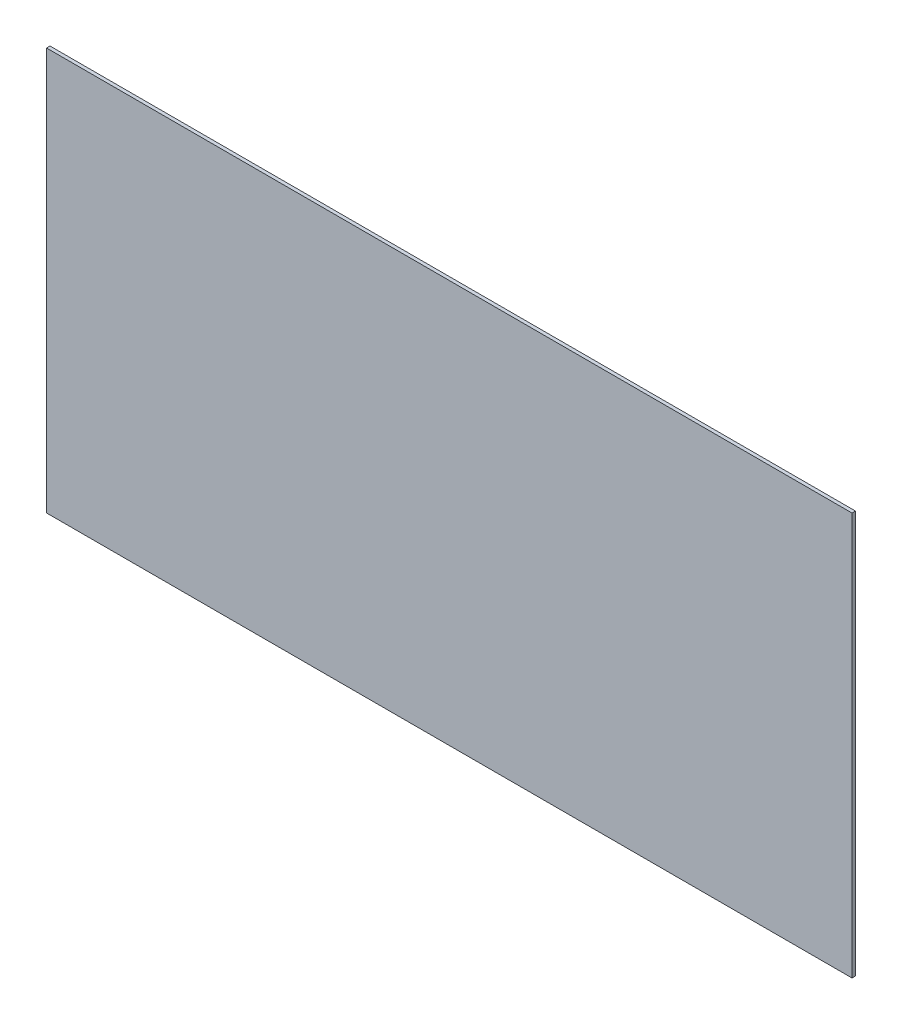
ISO-10303-21;
HEADER;
FILE_DESCRIPTION(('STEP AP214'),'2;1');
FILE_NAME('part.step','',(''),(''),'','','');
FILE_SCHEMA(('AUTOMOTIVE_DESIGN { 1 0 10303 214 1 1 1 1 }'));
ENDSEC;
DATA;
#1=APPLICATION_CONTEXT('core data for automotive mechanical design processes');
#2=APPLICATION_PROTOCOL_DEFINITION('international standard','automotive_design',2000,#1);
#3=PRODUCT_CONTEXT('',#1,'mechanical');
#4=PRODUCT('Part','Part','',(#3));
#5=PRODUCT_RELATED_PRODUCT_CATEGORY('part','',(#4));
#6=PRODUCT_DEFINITION_FORMATION('','',#4);
#7=PRODUCT_DEFINITION_CONTEXT('part definition',#1,'design');
#8=PRODUCT_DEFINITION('design','',#6,#7);
#9=PRODUCT_DEFINITION_SHAPE('','',#8);
#10=(LENGTH_UNIT() NAMED_UNIT(*) SI_UNIT(.MILLI.,.METRE.));
#11=(NAMED_UNIT(*) PLANE_ANGLE_UNIT() SI_UNIT($,.RADIAN.));
#12=(NAMED_UNIT(*) SI_UNIT($,.STERADIAN.) SOLID_ANGLE_UNIT());
#13=UNCERTAINTY_MEASURE_WITH_UNIT(LENGTH_MEASURE(1.E-05),#10,'distance_accuracy_value','');
#14=(GEOMETRIC_REPRESENTATION_CONTEXT(3) GLOBAL_UNCERTAINTY_ASSIGNED_CONTEXT((#13)) GLOBAL_UNIT_ASSIGNED_CONTEXT((#10,
#11,#12)) REPRESENTATION_CONTEXT('',''));
#15=CARTESIAN_POINT('',(0.,0.,0.));
#16=DIRECTION('',(0.,0.,1.));
#17=DIRECTION('',(1.,0.,0.));
#18=AXIS2_PLACEMENT_3D('',#15,#16,#17);
#19=CARTESIAN_POINT('',(-263.934426229508,175.,3.));
#20=DIRECTION('',(1.,0.,0.));
#21=DIRECTION('',(0.,1.,0.));
#22=AXIS2_PLACEMENT_3D('',#19,#20,#21);
#23=PLANE('',#22);
#24=DIRECTION('',(0.,-1.,0.));
#25=VECTOR('',#24,1.);
#26=CARTESIAN_POINT('',(-263.934426229508,175.,0.));
#27=LINE('',#26,#25);
#28=CARTESIAN_POINT('',(-263.934426229508,175.,0.));
#29=VERTEX_POINT('',#28);
#30=CARTESIAN_POINT('',(-263.934426229508,-175.,0.));
#31=VERTEX_POINT('',#30);
#32=EDGE_CURVE('E107',#29,#31,#27,.T.);
#33=ORIENTED_EDGE('',*,*,#32,.T.);
#34=DIRECTION('',(0.,0.,-1.));
#35=VECTOR('',#34,1.);
#36=CARTESIAN_POINT('',(-263.934426229508,-175.,3.));
#37=LINE('',#36,#35);
#38=CARTESIAN_POINT('',(-263.934426229508,-175.,3.));
#39=VERTEX_POINT('',#38);
#40=EDGE_CURVE('E11',#39,#31,#37,.T.);
#41=ORIENTED_EDGE('',*,*,#40,.F.);
#42=DIRECTION('',(0.,-1.,0.));
#43=VECTOR('',#42,1.);
#44=CARTESIAN_POINT('',(-263.934426229508,175.,3.));
#45=LINE('',#44,#43);
#46=CARTESIAN_POINT('',(-263.934426229508,175.,3.));
#47=VERTEX_POINT('',#46);
#48=EDGE_CURVE('E91',#47,#39,#45,.T.);
#49=ORIENTED_EDGE('',*,*,#48,.F.);
#50=DIRECTION('',(0.,0.,-1.));
#51=VECTOR('',#50,1.);
#52=CARTESIAN_POINT('',(-263.934426229508,175.,3.));
#53=LINE('',#52,#51);
#54=EDGE_CURVE('E103',#47,#29,#53,.T.);
#55=ORIENTED_EDGE('',*,*,#54,.T.);
#56=EDGE_LOOP('',(#33,#41,#49,#55));
#57=FACE_BOUND('',#56,.T.);
#58=ADVANCED_FACE('F39',(#57),#23,.F.);
#59=CARTESIAN_POINT('',(-263.934426229508,-175.,3.));
#60=DIRECTION('',(0.,1.,0.));
#61=DIRECTION('',(0.,0.,1.));
#62=AXIS2_PLACEMENT_3D('',#59,#60,#61);
#63=PLANE('',#62);
#64=DIRECTION('',(1.,0.,0.));
#65=VECTOR('',#64,1.);
#66=CARTESIAN_POINT('',(-263.934426229508,-175.,0.));
#67=LINE('',#66,#65);
#68=CARTESIAN_POINT('',(436.065573770492,-175.,0.));
#69=VERTEX_POINT('',#68);
#70=EDGE_CURVE('E96',#31,#69,#67,.T.);
#71=ORIENTED_EDGE('',*,*,#70,.T.);
#72=DIRECTION('',(0.,0.,-1.));
#73=VECTOR('',#72,1.);
#74=CARTESIAN_POINT('',(436.065573770492,-175.,3.));
#75=LINE('',#74,#73);
#76=CARTESIAN_POINT('',(436.065573770492,-175.,3.));
#77=VERTEX_POINT('',#76);
#78=EDGE_CURVE('E48',#77,#69,#75,.T.);
#79=ORIENTED_EDGE('',*,*,#78,.F.);
#80=DIRECTION('',(1.,0.,0.));
#81=VECTOR('',#80,1.);
#82=CARTESIAN_POINT('',(-263.934426229508,-175.,3.));
#83=LINE('',#82,#81);
#84=EDGE_CURVE('E86',#39,#77,#83,.T.);
#85=ORIENTED_EDGE('',*,*,#84,.F.);
#86=ORIENTED_EDGE('',*,*,#40,.T.);
#87=EDGE_LOOP('',(#71,#79,#85,#86));
#88=FACE_BOUND('',#87,.T.);
#89=ADVANCED_FACE('F95',(#88),#63,.F.);
#90=CARTESIAN_POINT('',(436.065573770492,175.,3.));
#91=DIRECTION('',(-1.,0.,0.));
#92=DIRECTION('',(0.,0.,1.));
#93=AXIS2_PLACEMENT_3D('',#90,#91,#92);
#94=PLANE('',#93);
#95=DIRECTION('',(0.,1.,0.));
#96=VECTOR('',#95,1.);
#97=CARTESIAN_POINT('',(436.065573770492,175.,0.));
#98=LINE('',#97,#96);
#99=CARTESIAN_POINT('',(436.065573770492,175.,0.));
#100=VERTEX_POINT('',#99);
#101=EDGE_CURVE('E73',#69,#100,#98,.T.);
#102=ORIENTED_EDGE('',*,*,#101,.T.);
#103=DIRECTION('',(0.,0.,-1.));
#104=VECTOR('',#103,1.);
#105=CARTESIAN_POINT('',(436.065573770492,175.,3.));
#106=LINE('',#105,#104);
#107=CARTESIAN_POINT('',(436.065573770492,175.,3.));
#108=VERTEX_POINT('',#107);
#109=EDGE_CURVE('E98',#108,#100,#106,.T.);
#110=ORIENTED_EDGE('',*,*,#109,.F.);
#111=DIRECTION('',(0.,1.,0.));
#112=VECTOR('',#111,1.);
#113=CARTESIAN_POINT('',(436.065573770492,175.,3.));
#114=LINE('',#113,#112);
#115=EDGE_CURVE('E89',#77,#108,#114,.T.);
#116=ORIENTED_EDGE('',*,*,#115,.F.);
#117=ORIENTED_EDGE('',*,*,#78,.T.);
#118=EDGE_LOOP('',(#102,#110,#116,#117));
#119=FACE_BOUND('',#118,.T.);
#120=ADVANCED_FACE('F99',(#119),#94,.F.);
#121=CARTESIAN_POINT('',(-263.934426229508,175.,3.));
#122=DIRECTION('',(0.,-1.,0.));
#123=DIRECTION('',(0.,0.,-1.));
#124=AXIS2_PLACEMENT_3D('',#121,#122,#123);
#125=PLANE('',#124);
#126=DIRECTION('',(-1.,0.,0.));
#127=VECTOR('',#126,1.);
#128=CARTESIAN_POINT('',(-263.934426229508,175.,0.));
#129=LINE('',#128,#127);
#130=EDGE_CURVE('E79',#100,#29,#129,.T.);
#131=ORIENTED_EDGE('',*,*,#130,.T.);
#132=ORIENTED_EDGE('',*,*,#54,.F.);
#133=DIRECTION('',(-1.,0.,0.));
#134=VECTOR('',#133,1.);
#135=CARTESIAN_POINT('',(-263.934426229508,175.,3.));
#136=LINE('',#135,#134);
#137=EDGE_CURVE('E56',#108,#47,#136,.T.);
#138=ORIENTED_EDGE('',*,*,#137,.F.);
#139=ORIENTED_EDGE('',*,*,#109,.T.);
#140=EDGE_LOOP('',(#131,#132,#138,#139));
#141=FACE_BOUND('',#140,.T.);
#142=ADVANCED_FACE('F120',(#141),#125,.F.);
#143=CARTESIAN_POINT('',(0.,0.,3.));
#144=DIRECTION('',(0.,0.,1.));
#145=DIRECTION('',(1.,0.,0.));
#146=AXIS2_PLACEMENT_3D('',#143,#144,#145);
#147=PLANE('',#146);
#148=ORIENTED_EDGE('',*,*,#48,.T.);
#149=ORIENTED_EDGE('',*,*,#84,.T.);
#150=ORIENTED_EDGE('',*,*,#115,.T.);
#151=ORIENTED_EDGE('',*,*,#137,.T.);
#152=EDGE_LOOP('',(#148,#149,#150,#151));
#153=FACE_BOUND('',#152,.T.);
#154=ADVANCED_FACE('F87',(#153),#147,.T.);
#155=CARTESIAN_POINT('',(0.,0.,0.));
#156=DIRECTION('',(0.,0.,1.));
#157=DIRECTION('',(1.,0.,0.));
#158=AXIS2_PLACEMENT_3D('',#155,#156,#157);
#159=PLANE('',#158);
#160=ORIENTED_EDGE('',*,*,#32,.F.);
#161=ORIENTED_EDGE('',*,*,#130,.F.);
#162=ORIENTED_EDGE('',*,*,#101,.F.);
#163=ORIENTED_EDGE('',*,*,#70,.F.);
#164=EDGE_LOOP('',(#160,#161,#162,#163));
#165=FACE_BOUND('',#164,.T.);
#166=ADVANCED_FACE('F123',(#165),#159,.F.);
#167=CLOSED_SHELL('',(#58,#89,#120,#142,#154,#166));
#168=MANIFOLD_SOLID_BREP('B2',#167);
#169=ADVANCED_BREP_SHAPE_REPRESENTATION('',(#18,#168),#14);
#170=SHAPE_DEFINITION_REPRESENTATION(#9,#169);
ENDSEC;
END-ISO-10303-21;
